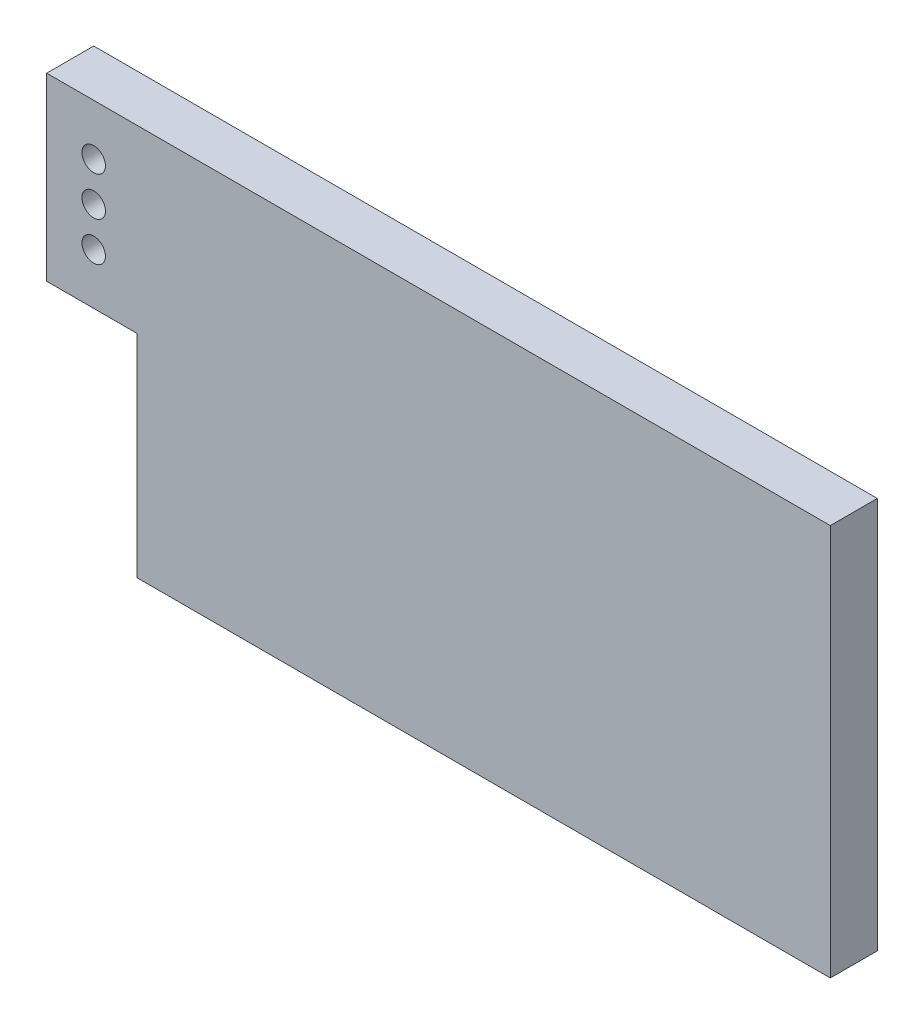
ISO-10303-21;
HEADER;
FILE_DESCRIPTION(('STEP AP214'),'2;1');
FILE_NAME('part.step','',(''),(''),'','','');
FILE_SCHEMA(('AUTOMOTIVE_DESIGN { 1 0 10303 214 1 1 1 1 }'));
ENDSEC;
DATA;
#1=APPLICATION_CONTEXT('core data for automotive mechanical design processes');
#2=APPLICATION_PROTOCOL_DEFINITION('international standard','automotive_design',2000,#1);
#3=PRODUCT_CONTEXT('',#1,'mechanical');
#4=PRODUCT('Part','Part','',(#3));
#5=PRODUCT_RELATED_PRODUCT_CATEGORY('part','',(#4));
#6=PRODUCT_DEFINITION_FORMATION('','',#4);
#7=PRODUCT_DEFINITION_CONTEXT('part definition',#1,'design');
#8=PRODUCT_DEFINITION('design','',#6,#7);
#9=PRODUCT_DEFINITION_SHAPE('','',#8);
#10=(LENGTH_UNIT() NAMED_UNIT(*) SI_UNIT(.MILLI.,.METRE.));
#11=(NAMED_UNIT(*) PLANE_ANGLE_UNIT() SI_UNIT($,.RADIAN.));
#12=(NAMED_UNIT(*) SI_UNIT($,.STERADIAN.) SOLID_ANGLE_UNIT());
#13=UNCERTAINTY_MEASURE_WITH_UNIT(LENGTH_MEASURE(1.E-05),#10,'distance_accuracy_value','');
#14=(GEOMETRIC_REPRESENTATION_CONTEXT(3) GLOBAL_UNCERTAINTY_ASSIGNED_CONTEXT((#13)) GLOBAL_UNIT_ASSIGNED_CONTEXT((#10,
#11,#12)) REPRESENTATION_CONTEXT('',''));
#15=CARTESIAN_POINT('',(0.,0.,0.));
#16=DIRECTION('',(0.,0.,1.));
#17=DIRECTION('',(1.,0.,0.));
#18=AXIS2_PLACEMENT_3D('',#15,#16,#17);
#19=CARTESIAN_POINT('',(5.,-2.5,0.6));
#20=DIRECTION('',(-1.,0.,0.));
#21=DIRECTION('',(0.,0.,1.));
#22=AXIS2_PLACEMENT_3D('',#19,#20,#21);
#23=PLANE('',#22);
#24=DIRECTION('',(0.,1.,0.));
#25=VECTOR('',#24,1.);
#26=CARTESIAN_POINT('',(5.,-2.5,0.));
#27=LINE('',#26,#25);
#28=CARTESIAN_POINT('',(5.,-2.5,0.));
#29=VERTEX_POINT('',#28);
#30=CARTESIAN_POINT('',(5.,2.5,0.));
#31=VERTEX_POINT('',#30);
#32=EDGE_CURVE('E111',#29,#31,#27,.T.);
#33=ORIENTED_EDGE('',*,*,#32,.T.);
#34=DIRECTION('',(0.,0.,-1.));
#35=VECTOR('',#34,1.);
#36=CARTESIAN_POINT('',(5.,2.5,0.6));
#37=LINE('',#36,#35);
#38=CARTESIAN_POINT('',(5.,2.5,0.6));
#39=VERTEX_POINT('',#38);
#40=EDGE_CURVE('E11',#39,#31,#37,.T.);
#41=ORIENTED_EDGE('',*,*,#40,.F.);
#42=DIRECTION('',(0.,1.,0.));
#43=VECTOR('',#42,1.);
#44=CARTESIAN_POINT('',(5.,-2.5,0.6));
#45=LINE('',#44,#43);
#46=CARTESIAN_POINT('',(5.,-2.5,0.6));
#47=VERTEX_POINT('',#46);
#48=EDGE_CURVE('E112',#47,#39,#45,.T.);
#49=ORIENTED_EDGE('',*,*,#48,.F.);
#50=DIRECTION('',(0.,0.,-1.));
#51=VECTOR('',#50,1.);
#52=CARTESIAN_POINT('',(5.,-2.5,0.6));
#53=LINE('',#52,#51);
#54=EDGE_CURVE('E121',#47,#29,#53,.T.);
#55=ORIENTED_EDGE('',*,*,#54,.T.);
#56=EDGE_LOOP('',(#33,#41,#49,#55));
#57=FACE_BOUND('',#56,.T.);
#58=ADVANCED_FACE('F37',(#57),#23,.F.);
#59=CARTESIAN_POINT('',(-5.,2.5,0.6));
#60=DIRECTION('',(0.,-1.,0.));
#61=DIRECTION('',(0.,0.,-1.));
#62=AXIS2_PLACEMENT_3D('',#59,#60,#61);
#63=PLANE('',#62);
#64=DIRECTION('',(-1.,0.,0.));
#65=VECTOR('',#64,1.);
#66=CARTESIAN_POINT('',(-5.,2.5,0.));
#67=LINE('',#66,#65);
#68=CARTESIAN_POINT('',(-5.,2.5,0.));
#69=VERTEX_POINT('',#68);
#70=EDGE_CURVE('E117',#31,#69,#67,.T.);
#71=ORIENTED_EDGE('',*,*,#70,.T.);
#72=DIRECTION('',(0.,0.,-1.));
#73=VECTOR('',#72,1.);
#74=CARTESIAN_POINT('',(-5.,2.5,0.6));
#75=LINE('',#74,#73);
#76=CARTESIAN_POINT('',(-5.,2.5,0.6));
#77=VERTEX_POINT('',#76);
#78=EDGE_CURVE('E44',#77,#69,#75,.T.);
#79=ORIENTED_EDGE('',*,*,#78,.F.);
#80=DIRECTION('',(-1.,0.,0.));
#81=VECTOR('',#80,1.);
#82=CARTESIAN_POINT('',(-5.,2.5,0.6));
#83=LINE('',#82,#81);
#84=EDGE_CURVE('E83',#39,#77,#83,.T.);
#85=ORIENTED_EDGE('',*,*,#84,.F.);
#86=ORIENTED_EDGE('',*,*,#40,.T.);
#87=EDGE_LOOP('',(#71,#79,#85,#86));
#88=FACE_BOUND('',#87,.T.);
#89=ADVANCED_FACE('F143',(#88),#63,.F.);
#90=CARTESIAN_POINT('',(-5.,-2.5,0.6));
#91=DIRECTION('',(1.,0.,0.));
#92=DIRECTION('',(0.,0.,-1.));
#93=AXIS2_PLACEMENT_3D('',#90,#91,#92);
#94=PLANE('',#93);
#95=DIRECTION('',(0.,-1.,0.));
#96=VECTOR('',#95,1.);
#97=CARTESIAN_POINT('',(-5.,-2.5,0.));
#98=LINE('',#97,#96);
#99=CARTESIAN_POINT('',(-5.,0.2,0.));
#100=VERTEX_POINT('',#99);
#101=EDGE_CURVE('E113',#69,#100,#98,.T.);
#102=ORIENTED_EDGE('',*,*,#101,.T.);
#103=DIRECTION('',(0.,0.,1.));
#104=VECTOR('',#103,1.);
#105=CARTESIAN_POINT('',(-5.,0.2,0.));
#106=LINE('',#105,#104);
#107=CARTESIAN_POINT('',(-5.,0.2,0.6));
#108=VERTEX_POINT('',#107);
#109=EDGE_CURVE('E137',#100,#108,#106,.T.);
#110=ORIENTED_EDGE('',*,*,#109,.T.);
#111=DIRECTION('',(0.,-1.,0.));
#112=VECTOR('',#111,1.);
#113=CARTESIAN_POINT('',(-5.,-2.5,0.6));
#114=LINE('',#113,#112);
#115=EDGE_CURVE('E129',#77,#108,#114,.T.);
#116=ORIENTED_EDGE('',*,*,#115,.F.);
#117=ORIENTED_EDGE('',*,*,#78,.T.);
#118=EDGE_LOOP('',(#102,#110,#116,#117));
#119=FACE_BOUND('',#118,.T.);
#120=ADVANCED_FACE('F126',(#119),#94,.F.);
#121=CARTESIAN_POINT('',(-5.,-2.5,0.6));
#122=DIRECTION('',(0.,1.,0.));
#123=DIRECTION('',(0.,0.,1.));
#124=AXIS2_PLACEMENT_3D('',#121,#122,#123);
#125=PLANE('',#124);
#126=DIRECTION('',(1.,0.,0.));
#127=VECTOR('',#126,1.);
#128=CARTESIAN_POINT('',(-5.,-2.5,0.6));
#129=LINE('',#128,#127);
#130=CARTESIAN_POINT('',(-3.85,-2.5,0.6));
#131=VERTEX_POINT('',#130);
#132=EDGE_CURVE('E60',#131,#47,#129,.T.);
#133=ORIENTED_EDGE('',*,*,#132,.F.);
#134=DIRECTION('',(0.,0.,1.));
#135=VECTOR('',#134,1.);
#136=CARTESIAN_POINT('',(-3.85,-2.5,0.));
#137=LINE('',#136,#135);
#138=CARTESIAN_POINT('',(-3.85,-2.5,0.));
#139=VERTEX_POINT('',#138);
#140=EDGE_CURVE('E101',#139,#131,#137,.T.);
#141=ORIENTED_EDGE('',*,*,#140,.F.);
#142=DIRECTION('',(1.,0.,0.));
#143=VECTOR('',#142,1.);
#144=CARTESIAN_POINT('',(-5.,-2.5,0.));
#145=LINE('',#144,#143);
#146=EDGE_CURVE('E78',#139,#29,#145,.T.);
#147=ORIENTED_EDGE('',*,*,#146,.T.);
#148=ORIENTED_EDGE('',*,*,#54,.F.);
#149=EDGE_LOOP('',(#133,#141,#147,#148));
#150=FACE_BOUND('',#149,.T.);
#151=ADVANCED_FACE('F106',(#150),#125,.F.);
#152=CARTESIAN_POINT('',(0.,0.,0.6));
#153=DIRECTION('',(0.,0.,-1.));
#154=DIRECTION('',(-1.,0.,0.));
#155=AXIS2_PLACEMENT_3D('',#152,#153,#154);
#156=PLANE('',#155);
#157=CARTESIAN_POINT('',(-4.4,1.85,0.6));
#158=DIRECTION('',(0.,0.,1.));
#159=DIRECTION('',(1.,0.,0.));
#160=AXIS2_PLACEMENT_3D('',#157,#158,#159);
#161=CIRCLE('',#160,0.15);
#162=CARTESIAN_POINT('',(-4.25,1.85,0.6));
#163=VERTEX_POINT('',#162);
#164=EDGE_CURVE('E182',#163,#163,#161,.T.);
#165=ORIENTED_EDGE('',*,*,#164,.F.);
#166=EDGE_LOOP('',(#165));
#167=FACE_BOUND('',#166,.T.);
#168=CARTESIAN_POINT('',(-4.4,1.35,0.6));
#169=DIRECTION('',(0.,0.,1.));
#170=DIRECTION('',(1.,0.,0.));
#171=AXIS2_PLACEMENT_3D('',#168,#169,#170);
#172=CIRCLE('',#171,0.15);
#173=CARTESIAN_POINT('',(-4.25,1.35,0.6));
#174=VERTEX_POINT('',#173);
#175=EDGE_CURVE('E186',#174,#174,#172,.T.);
#176=ORIENTED_EDGE('',*,*,#175,.F.);
#177=EDGE_LOOP('',(#176));
#178=FACE_BOUND('',#177,.T.);
#179=CARTESIAN_POINT('',(-4.4,0.85,0.6));
#180=DIRECTION('',(0.,0.,1.));
#181=DIRECTION('',(1.,0.,0.));
#182=AXIS2_PLACEMENT_3D('',#179,#180,#181);
#183=CIRCLE('',#182,0.15);
#184=CARTESIAN_POINT('',(-4.25,0.85,0.6));
#185=VERTEX_POINT('',#184);
#186=EDGE_CURVE('E189',#185,#185,#183,.T.);
#187=ORIENTED_EDGE('',*,*,#186,.F.);
#188=EDGE_LOOP('',(#187));
#189=FACE_BOUND('',#188,.T.);
#190=ORIENTED_EDGE('',*,*,#115,.T.);
#191=DIRECTION('',(-1.,0.,0.));
#192=VECTOR('',#191,1.);
#193=CARTESIAN_POINT('',(-5.,0.2,0.6));
#194=LINE('',#193,#192);
#195=CARTESIAN_POINT('',(-3.85,0.2,0.6));
#196=VERTEX_POINT('',#195);
#197=EDGE_CURVE('E104',#196,#108,#194,.T.);
#198=ORIENTED_EDGE('',*,*,#197,.F.);
#199=DIRECTION('',(0.,1.,0.));
#200=VECTOR('',#199,1.);
#201=CARTESIAN_POINT('',(-3.85,-2.5,0.6));
#202=LINE('',#201,#200);
#203=EDGE_CURVE('E133',#131,#196,#202,.T.);
#204=ORIENTED_EDGE('',*,*,#203,.F.);
#205=ORIENTED_EDGE('',*,*,#132,.T.);
#206=ORIENTED_EDGE('',*,*,#48,.T.);
#207=ORIENTED_EDGE('',*,*,#84,.T.);
#208=EDGE_LOOP('',(#190,#198,#204,#205,#206,#207));
#209=FACE_BOUND('',#208,.T.);
#210=ADVANCED_FACE('F147',(#167,#178,#189,#209),#156,.F.);
#211=CARTESIAN_POINT('',(0.,0.,0.));
#212=DIRECTION('',(0.,0.,-1.));
#213=DIRECTION('',(-1.,0.,0.));
#214=AXIS2_PLACEMENT_3D('',#211,#212,#213);
#215=PLANE('',#214);
#216=CARTESIAN_POINT('',(-4.4,1.85,0.));
#217=DIRECTION('',(0.,0.,1.));
#218=DIRECTION('',(1.,0.,0.));
#219=AXIS2_PLACEMENT_3D('',#216,#217,#218);
#220=CIRCLE('',#219,0.15);
#221=CARTESIAN_POINT('',(-4.25,1.85,0.));
#222=VERTEX_POINT('',#221);
#223=EDGE_CURVE('E135',#222,#222,#220,.T.);
#224=ORIENTED_EDGE('',*,*,#223,.T.);
#225=EDGE_LOOP('',(#224));
#226=FACE_BOUND('',#225,.T.);
#227=CARTESIAN_POINT('',(-4.4,1.35,0.));
#228=DIRECTION('',(0.,0.,1.));
#229=DIRECTION('',(1.,0.,0.));
#230=AXIS2_PLACEMENT_3D('',#227,#228,#229);
#231=CIRCLE('',#230,0.15);
#232=CARTESIAN_POINT('',(-4.25,1.35,0.));
#233=VERTEX_POINT('',#232);
#234=EDGE_CURVE('E191',#233,#233,#231,.T.);
#235=ORIENTED_EDGE('',*,*,#234,.T.);
#236=EDGE_LOOP('',(#235));
#237=FACE_BOUND('',#236,.T.);
#238=CARTESIAN_POINT('',(-4.4,0.85,0.));
#239=DIRECTION('',(0.,0.,1.));
#240=DIRECTION('',(1.,0.,0.));
#241=AXIS2_PLACEMENT_3D('',#238,#239,#240);
#242=CIRCLE('',#241,0.15);
#243=CARTESIAN_POINT('',(-4.25,0.85,0.));
#244=VERTEX_POINT('',#243);
#245=EDGE_CURVE('E192',#244,#244,#242,.T.);
#246=ORIENTED_EDGE('',*,*,#245,.T.);
#247=EDGE_LOOP('',(#246));
#248=FACE_BOUND('',#247,.T.);
#249=DIRECTION('',(-1.,0.,0.));
#250=VECTOR('',#249,1.);
#251=CARTESIAN_POINT('',(-5.,0.2,0.));
#252=LINE('',#251,#250);
#253=CARTESIAN_POINT('',(-3.85,0.2,0.));
#254=VERTEX_POINT('',#253);
#255=EDGE_CURVE('E51',#254,#100,#252,.T.);
#256=ORIENTED_EDGE('',*,*,#255,.T.);
#257=ORIENTED_EDGE('',*,*,#101,.F.);
#258=ORIENTED_EDGE('',*,*,#70,.F.);
#259=ORIENTED_EDGE('',*,*,#32,.F.);
#260=ORIENTED_EDGE('',*,*,#146,.F.);
#261=DIRECTION('',(0.,1.,0.));
#262=VECTOR('',#261,1.);
#263=CARTESIAN_POINT('',(-3.85,-2.5,0.));
#264=LINE('',#263,#262);
#265=EDGE_CURVE('E98',#139,#254,#264,.T.);
#266=ORIENTED_EDGE('',*,*,#265,.T.);
#267=EDGE_LOOP('',(#256,#257,#258,#259,#260,#266));
#268=FACE_BOUND('',#267,.T.);
#269=ADVANCED_FACE('F109',(#226,#237,#248,#268),#215,.T.);
#270=CARTESIAN_POINT('',(-5.,0.2,0.));
#271=DIRECTION('',(0.,1.,0.));
#272=DIRECTION('',(0.,0.,1.));
#273=AXIS2_PLACEMENT_3D('',#270,#271,#272);
#274=PLANE('',#273);
#275=ORIENTED_EDGE('',*,*,#197,.T.);
#276=ORIENTED_EDGE('',*,*,#109,.F.);
#277=ORIENTED_EDGE('',*,*,#255,.F.);
#278=DIRECTION('',(0.,0.,1.));
#279=VECTOR('',#278,1.);
#280=CARTESIAN_POINT('',(-3.85,0.2,0.));
#281=LINE('',#280,#279);
#282=EDGE_CURVE('E102',#254,#196,#281,.T.);
#283=ORIENTED_EDGE('',*,*,#282,.T.);
#284=EDGE_LOOP('',(#275,#276,#277,#283));
#285=FACE_BOUND('',#284,.T.);
#286=ADVANCED_FACE('F149',(#285),#274,.F.);
#287=CARTESIAN_POINT('',(-3.85,-2.5,0.));
#288=DIRECTION('',(1.,0.,0.));
#289=DIRECTION('',(0.,0.,-1.));
#290=AXIS2_PLACEMENT_3D('',#287,#288,#289);
#291=PLANE('',#290);
#292=ORIENTED_EDGE('',*,*,#203,.T.);
#293=ORIENTED_EDGE('',*,*,#282,.F.);
#294=ORIENTED_EDGE('',*,*,#265,.F.);
#295=ORIENTED_EDGE('',*,*,#140,.T.);
#296=EDGE_LOOP('',(#292,#293,#294,#295));
#297=FACE_BOUND('',#296,.T.);
#298=ADVANCED_FACE('F100',(#297),#291,.F.);
#299=CARTESIAN_POINT('',(-4.4,0.85,0.));
#300=DIRECTION('',(0.,0.,1.));
#301=DIRECTION('',(1.,0.,0.));
#302=AXIS2_PLACEMENT_3D('',#299,#300,#301);
#303=CYLINDRICAL_SURFACE('',#302,0.15);
#304=ORIENTED_EDGE('',*,*,#245,.F.);
#305=EDGE_LOOP('',(#304));
#306=FACE_BOUND('',#305,.T.);
#307=ORIENTED_EDGE('',*,*,#186,.T.);
#308=EDGE_LOOP('',(#307));
#309=FACE_BOUND('',#308,.T.);
#310=ADVANCED_FACE('F156',(#306,#309),#303,.F.);
#311=CARTESIAN_POINT('',(-4.4,1.35,0.));
#312=DIRECTION('',(0.,0.,1.));
#313=DIRECTION('',(1.,0.,0.));
#314=AXIS2_PLACEMENT_3D('',#311,#312,#313);
#315=CYLINDRICAL_SURFACE('',#314,0.15);
#316=ORIENTED_EDGE('',*,*,#234,.F.);
#317=EDGE_LOOP('',(#316));
#318=FACE_BOUND('',#317,.T.);
#319=ORIENTED_EDGE('',*,*,#175,.T.);
#320=EDGE_LOOP('',(#319));
#321=FACE_BOUND('',#320,.T.);
#322=ADVANCED_FACE('F207',(#318,#321),#315,.F.);
#323=CARTESIAN_POINT('',(-4.4,1.85,0.));
#324=DIRECTION('',(0.,0.,1.));
#325=DIRECTION('',(1.,0.,0.));
#326=AXIS2_PLACEMENT_3D('',#323,#324,#325);
#327=CYLINDRICAL_SURFACE('',#326,0.15);
#328=ORIENTED_EDGE('',*,*,#223,.F.);
#329=EDGE_LOOP('',(#328));
#330=FACE_BOUND('',#329,.T.);
#331=ORIENTED_EDGE('',*,*,#164,.T.);
#332=EDGE_LOOP('',(#331));
#333=FACE_BOUND('',#332,.T.);
#334=ADVANCED_FACE('F204',(#330,#333),#327,.F.);
#335=CLOSED_SHELL('',(#58,#89,#120,#151,#210,#269,#286,#298,#310,#322,#334));
#336=MANIFOLD_SOLID_BREP('B2',#335);
#337=ADVANCED_BREP_SHAPE_REPRESENTATION('',(#18,#336),#14);
#338=SHAPE_DEFINITION_REPRESENTATION(#9,#337);
ENDSEC;
END-ISO-10303-21;
